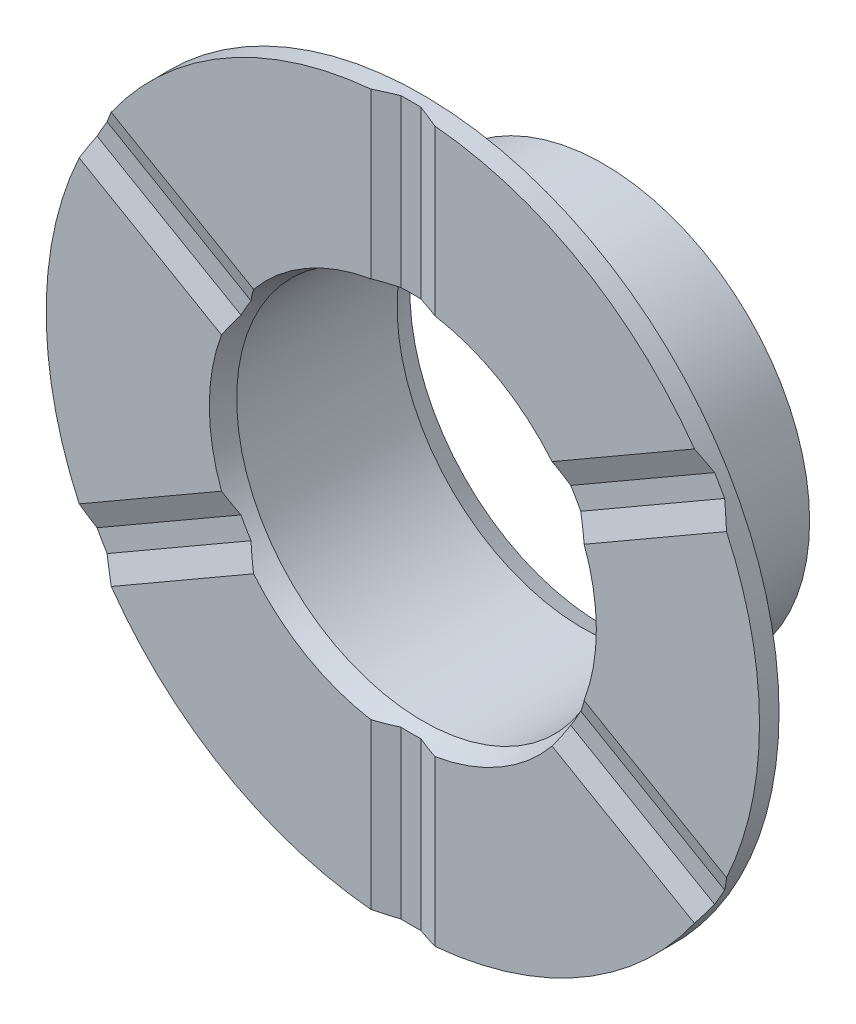
ISO-10303-21;
HEADER;
FILE_DESCRIPTION(('STEP AP214'),'2;1');
FILE_NAME('part.step','',(''),(''),'','','');
FILE_SCHEMA(('AUTOMOTIVE_DESIGN { 1 0 10303 214 1 1 1 1 }'));
ENDSEC;
DATA;
#1=APPLICATION_CONTEXT('core data for automotive mechanical design processes');
#2=APPLICATION_PROTOCOL_DEFINITION('international standard','automotive_design',2000,#1);
#3=PRODUCT_CONTEXT('',#1,'mechanical');
#4=PRODUCT('Part','Part','',(#3));
#5=PRODUCT_RELATED_PRODUCT_CATEGORY('part','',(#4));
#6=PRODUCT_DEFINITION_FORMATION('','',#4);
#7=PRODUCT_DEFINITION_CONTEXT('part definition',#1,'design');
#8=PRODUCT_DEFINITION('design','',#6,#7);
#9=PRODUCT_DEFINITION_SHAPE('','',#8);
#10=(LENGTH_UNIT() NAMED_UNIT(*) SI_UNIT(.MILLI.,.METRE.));
#11=(NAMED_UNIT(*) PLANE_ANGLE_UNIT() SI_UNIT($,.RADIAN.));
#12=(NAMED_UNIT(*) SI_UNIT($,.STERADIAN.) SOLID_ANGLE_UNIT());
#13=UNCERTAINTY_MEASURE_WITH_UNIT(LENGTH_MEASURE(1.E-05),#10,'distance_accuracy_value','');
#14=(GEOMETRIC_REPRESENTATION_CONTEXT(3) GLOBAL_UNCERTAINTY_ASSIGNED_CONTEXT((#13)) GLOBAL_UNIT_ASSIGNED_CONTEXT((#10,
#11,#12)) REPRESENTATION_CONTEXT('',''));
#15=CARTESIAN_POINT('',(0.,0.,0.));
#16=DIRECTION('',(0.,0.,1.));
#17=DIRECTION('',(1.,0.,0.));
#18=AXIS2_PLACEMENT_3D('',#15,#16,#17);
#19=CARTESIAN_POINT('',(0.,0.,20.));
#20=DIRECTION('',(0.,0.,1.));
#21=DIRECTION('',(1.,0.,0.));
#22=AXIS2_PLACEMENT_3D('',#19,#20,#21);
#23=PLANE('',#22);
#24=CARTESIAN_POINT('',(0.,0.,20.));
#25=DIRECTION('',(0.,0.,1.));
#26=DIRECTION('',(1.,0.,0.));
#27=AXIS2_PLACEMENT_3D('',#24,#25,#26);
#28=CIRCLE('',#27,35.575);
#29=CARTESIAN_POINT('',(32.2831098634722,-14.9459507072311,20.));
#30=VERTEX_POINT('',#29);
#31=CARTESIAN_POINT('',(32.2831098634719,14.9459507072317,20.));
#32=VERTEX_POINT('',#31);
#33=EDGE_CURVE('E497',#30,#32,#28,.T.);
#34=ORIENTED_EDGE('',*,*,#33,.T.);
#35=DIRECTION('',(-0.866025403784433,-0.50000000000001,0.));
#36=VECTOR('',#35,1.);
#37=CARTESIAN_POINT('',(18.2933802362989,6.86897654109306,20.));
#38=LINE('',#37,#36);
#39=CARTESIAN_POINT('',(18.0848126550267,6.74855999190134,20.));
#40=VERTEX_POINT('',#39);
#41=EDGE_CURVE('E66',#32,#40,#38,.T.);
#42=ORIENTED_EDGE('',*,*,#41,.T.);
#43=CARTESIAN_POINT('',(0.,0.,20.));
#44=DIRECTION('',(0.,0.,1.));
#45=DIRECTION('',(1.,0.,0.));
#46=AXIS2_PLACEMENT_3D('',#43,#44,#45);
#47=CIRCLE('',#46,19.3029404685324);
#48=CARTESIAN_POINT('',(18.0848126550268,-6.74855999190097,20.));
#49=VERTEX_POINT('',#48);
#50=EDGE_CURVE('E309',#40,#49,#47,.F.);
#51=ORIENTED_EDGE('',*,*,#50,.T.);
#52=DIRECTION('',(0.866025403784443,-0.499999999999992,0.));
#53=VECTOR('',#52,1.);
#54=CARTESIAN_POINT('',(32.3956704762939,-15.0109376073438,20.));
#55=LINE('',#54,#53);
#56=EDGE_CURVE('E415',#49,#30,#55,.T.);
#57=ORIENTED_EDGE('',*,*,#56,.T.);
#58=EDGE_LOOP('',(#34,#42,#51,#57));
#59=FACE_BOUND('',#58,.T.);
#60=ADVANCED_FACE('F41',(#59),#23,.T.);
#61=CARTESIAN_POINT('',(3.19798193556369,-35.4309686085465,20.));
#62=VERTEX_POINT('',#61);
#63=CARTESIAN_POINT('',(29.0851279279086,-20.4850179013149,20.));
#64=VERTEX_POINT('',#63);
#65=EDGE_CURVE('E492',#62,#64,#28,.T.);
#66=ORIENTED_EDGE('',*,*,#65,.T.);
#67=DIRECTION('',(-0.866025403784443,0.499999999999992,0.));
#68=VECTOR('',#67,1.);
#69=CARTESIAN_POINT('',(15.0953983007354,-12.4080437351765,20.));
#70=LINE('',#69,#68);
#71=CARTESIAN_POINT('',(14.8868307194632,-12.2876271859848,20.));
#72=VERTEX_POINT('',#71);
#73=EDGE_CURVE('E405',#64,#72,#70,.T.);
#74=ORIENTED_EDGE('',*,*,#73,.T.);
#75=CARTESIAN_POINT('',(3.19798193556368,-19.0361871778861,20.));
#76=VERTEX_POINT('',#75);
#77=EDGE_CURVE('E799',#72,#76,#47,.F.);
#78=ORIENTED_EDGE('',*,*,#77,.T.);
#79=DIRECTION('',(0.,-1.,0.));
#80=VECTOR('',#79,1.);
#81=CARTESIAN_POINT('',(3.19798193556369,-35.560942408772,20.));
#82=LINE('',#81,#80);
#83=EDGE_CURVE('E396',#76,#62,#82,.T.);
#84=ORIENTED_EDGE('',*,*,#83,.T.);
#85=EDGE_LOOP('',(#66,#74,#78,#84));
#86=FACE_BOUND('',#85,.T.);
#87=ADVANCED_FACE('F538',(#86),#23,.T.);
#88=CARTESIAN_POINT('',(-29.0851279279083,-20.4850179013153,20.));
#89=VERTEX_POINT('',#88);
#90=CARTESIAN_POINT('',(-3.19798193556368,-35.4309686085465,20.));
#91=VERTEX_POINT('',#90);
#92=EDGE_CURVE('E477',#89,#91,#28,.T.);
#93=ORIENTED_EDGE('',*,*,#92,.T.);
#94=DIRECTION('',(0.,1.,0.));
#95=VECTOR('',#94,1.);
#96=CARTESIAN_POINT('',(-3.19798193556368,-19.2770202762695,20.));
#97=LINE('',#96,#95);
#98=CARTESIAN_POINT('',(-3.19798193556368,-19.0361871778861,20.));
#99=VERTEX_POINT('',#98);
#100=EDGE_CURVE('E386',#91,#99,#97,.T.);
#101=ORIENTED_EDGE('',*,*,#100,.T.);
#102=CARTESIAN_POINT('',(-14.886830719463,-12.287627185985,20.));
#103=VERTEX_POINT('',#102);
#104=EDGE_CURVE('E807',#99,#103,#47,.F.);
#105=ORIENTED_EDGE('',*,*,#104,.T.);
#106=DIRECTION('',(-0.866025403784436,-0.500000000000004,0.));
#107=VECTOR('',#106,1.);
#108=CARTESIAN_POINT('',(-29.19768854073,-20.550004801428,20.));
#109=LINE('',#108,#107);
#110=EDGE_CURVE('E377',#103,#89,#109,.T.);
#111=ORIENTED_EDGE('',*,*,#110,.T.);
#112=EDGE_LOOP('',(#93,#101,#105,#111));
#113=FACE_BOUND('',#112,.T.);
#114=ADVANCED_FACE('F543',(#113),#23,.T.);
#115=CARTESIAN_POINT('',(-32.2831098634721,14.9459507072313,20.));
#116=VERTEX_POINT('',#115);
#117=CARTESIAN_POINT('',(-32.283109863472,-14.9459507072315,20.));
#118=VERTEX_POINT('',#117);
#119=EDGE_CURVE('E289',#116,#118,#28,.T.);
#120=ORIENTED_EDGE('',*,*,#119,.T.);
#121=DIRECTION('',(0.866025403784436,0.500000000000004,0.));
#122=VECTOR('',#121,1.);
#123=CARTESIAN_POINT('',(-18.2933802362989,-6.86897654109293,20.));
#124=LINE('',#123,#122);
#125=CARTESIAN_POINT('',(-18.0848126550267,-6.74855999190122,20.));
#126=VERTEX_POINT('',#125);
#127=EDGE_CURVE('E367',#118,#126,#124,.T.);
#128=ORIENTED_EDGE('',*,*,#127,.T.);
#129=CARTESIAN_POINT('',(-18.0848126550268,6.7485599919011,20.));
#130=VERTEX_POINT('',#129);
#131=EDGE_CURVE('E483',#126,#130,#47,.F.);
#132=ORIENTED_EDGE('',*,*,#131,.T.);
#133=DIRECTION('',(-0.86602540378444,0.499999999999998,0.));
#134=VECTOR('',#133,1.);
#135=CARTESIAN_POINT('',(-32.3956704762938,15.010937607344,20.));
#136=LINE('',#135,#134);
#137=EDGE_CURVE('E217',#130,#116,#136,.T.);
#138=ORIENTED_EDGE('',*,*,#137,.T.);
#139=EDGE_LOOP('',(#120,#128,#132,#138));
#140=FACE_BOUND('',#139,.T.);
#141=ADVANCED_FACE('F487',(#140),#23,.T.);
#142=CARTESIAN_POINT('',(-3.19798193556369,35.4309686085465,20.));
#143=VERTEX_POINT('',#142);
#144=CARTESIAN_POINT('',(-29.0851279279085,20.4850179013151,20.));
#145=VERTEX_POINT('',#144);
#146=EDGE_CURVE('E285',#143,#145,#28,.T.);
#147=ORIENTED_EDGE('',*,*,#146,.T.);
#148=DIRECTION('',(0.86602540378444,-0.499999999999998,0.));
#149=VECTOR('',#148,1.);
#150=CARTESIAN_POINT('',(-15.0953983007353,12.4080437351766,20.));
#151=LINE('',#150,#149);
#152=CARTESIAN_POINT('',(-14.8868307194631,12.2876271859849,20.));
#153=VERTEX_POINT('',#152);
#154=EDGE_CURVE('E354',#145,#153,#151,.T.);
#155=ORIENTED_EDGE('',*,*,#154,.T.);
#156=CARTESIAN_POINT('',(-3.19798193556368,19.0361871778861,20.));
#157=VERTEX_POINT('',#156);
#158=EDGE_CURVE('E212',#153,#157,#47,.F.);
#159=ORIENTED_EDGE('',*,*,#158,.T.);
#160=DIRECTION('',(0.,1.,0.));
#161=VECTOR('',#160,1.);
#162=CARTESIAN_POINT('',(-3.19798193556369,35.560942408772,20.));
#163=LINE('',#162,#161);
#164=EDGE_CURVE('E324',#157,#143,#163,.T.);
#165=ORIENTED_EDGE('',*,*,#164,.T.);
#166=EDGE_LOOP('',(#147,#155,#159,#165));
#167=FACE_BOUND('',#166,.T.);
#168=ADVANCED_FACE('F525',(#167),#23,.T.);
#169=CARTESIAN_POINT('',(0.,0.,20.));
#170=DIRECTION('',(0.,0.,-1.));
#171=DIRECTION('',(-1.,0.,0.));
#172=AXIS2_PLACEMENT_3D('',#169,#170,#171);
#173=CYLINDRICAL_SURFACE('',#172,20.575);
#174=CARTESIAN_POINT('',(0.,0.,0.));
#175=DIRECTION('',(0.,0.,1.));
#176=DIRECTION('',(1.,0.,0.));
#177=AXIS2_PLACEMENT_3D('',#174,#175,#176);
#178=CIRCLE('',#177,20.575);
#179=CARTESIAN_POINT('',(20.575,0.,0.));
#180=VERTEX_POINT('',#179);
#181=EDGE_CURVE('E284',#180,#180,#178,.T.);
#182=ORIENTED_EDGE('',*,*,#181,.T.);
#183=EDGE_LOOP('',(#182));
#184=FACE_BOUND('',#183,.T.);
#185=CARTESIAN_POINT('',(0.,0.,18.05));
#186=DIRECTION('',(0.,0.,1.));
#187=DIRECTION('',(1.,0.,0.));
#188=AXIS2_PLACEMENT_3D('',#185,#186,#187);
#189=CIRCLE('',#188,20.575);
#190=CARTESIAN_POINT('',(20.575,0.,18.05));
#191=VERTEX_POINT('',#190);
#192=EDGE_CURVE('E293',#191,#191,#189,.T.);
#193=ORIENTED_EDGE('',*,*,#192,.F.);
#194=EDGE_LOOP('',(#193));
#195=FACE_BOUND('',#194,.T.);
#196=ADVANCED_FACE('F548',(#184,#195),#173,.T.);
#197=CARTESIAN_POINT('',(3.19798193556368,19.0361871778861,20.));
#198=VERTEX_POINT('',#197);
#199=CARTESIAN_POINT('',(14.8868307194629,12.2876271859851,20.));
#200=VERTEX_POINT('',#199);
#201=EDGE_CURVE('E305',#198,#200,#47,.F.);
#202=ORIENTED_EDGE('',*,*,#201,.T.);
#203=DIRECTION('',(0.866025403784433,0.50000000000001,0.));
#204=VECTOR('',#203,1.);
#205=CARTESIAN_POINT('',(29.1976885407299,20.5500048014283,20.));
#206=LINE('',#205,#204);
#207=CARTESIAN_POINT('',(29.0851279279082,20.4850179013155,20.));
#208=VERTEX_POINT('',#207);
#209=EDGE_CURVE('E11',#200,#208,#206,.T.);
#210=ORIENTED_EDGE('',*,*,#209,.T.);
#211=CARTESIAN_POINT('',(3.19798193556368,35.4309686085465,20.));
#212=VERTEX_POINT('',#211);
#213=EDGE_CURVE('E279',#208,#212,#28,.T.);
#214=ORIENTED_EDGE('',*,*,#213,.T.);
#215=DIRECTION('',(0.,-1.,0.));
#216=VECTOR('',#215,1.);
#217=CARTESIAN_POINT('',(3.19798193556368,19.2770202762695,20.));
#218=LINE('',#217,#216);
#219=EDGE_CURVE('E327',#212,#198,#218,.T.);
#220=ORIENTED_EDGE('',*,*,#219,.T.);
#221=EDGE_LOOP('',(#202,#210,#214,#220));
#222=FACE_BOUND('',#221,.T.);
#223=ADVANCED_FACE('F506',(#222),#23,.T.);
#224=CARTESIAN_POINT('',(0.,0.,0.));
#225=DIRECTION('',(0.,0.,1.));
#226=DIRECTION('',(1.,0.,0.));
#227=AXIS2_PLACEMENT_3D('',#224,#225,#226);
#228=PLANE('',#227);
#229=CARTESIAN_POINT('',(0.,0.,0.));
#230=DIRECTION('',(0.,0.,1.));
#231=DIRECTION('',(1.,0.,0.));
#232=AXIS2_PLACEMENT_3D('',#229,#230,#231);
#233=CIRCLE('',#232,19.3029404685324);
#234=CARTESIAN_POINT('',(19.3029404685324,0.,0.));
#235=VERTEX_POINT('',#234);
#236=EDGE_CURVE('E308',#235,#235,#233,.T.);
#237=ORIENTED_EDGE('',*,*,#236,.T.);
#238=EDGE_LOOP('',(#237));
#239=FACE_BOUND('',#238,.T.);
#240=ORIENTED_EDGE('',*,*,#181,.F.);
#241=EDGE_LOOP('',(#240));
#242=FACE_BOUND('',#241,.T.);
#243=ADVANCED_FACE('F547',(#239,#242),#228,.F.);
#244=CARTESIAN_POINT('',(0.,0.,20.));
#245=DIRECTION('',(0.,0.,-1.));
#246=DIRECTION('',(-1.,0.,0.));
#247=AXIS2_PLACEMENT_3D('',#244,#245,#246);
#248=CYLINDRICAL_SURFACE('',#247,18.575);
#249=CARTESIAN_POINT('',(0.,0.,18.));
#250=DIRECTION('',(0.,0.,1.));
#251=DIRECTION('',(1.,0.,0.));
#252=AXIS2_PLACEMENT_3D('',#249,#250,#251);
#253=CIRCLE('',#252,18.575);
#254=CARTESIAN_POINT('',(18.575,0.,18.));
#255=VERTEX_POINT('',#254);
#256=EDGE_CURVE('E301',#255,#255,#253,.T.);
#257=ORIENTED_EDGE('',*,*,#256,.T.);
#258=EDGE_LOOP('',(#257));
#259=FACE_BOUND('',#258,.T.);
#260=CARTESIAN_POINT('',(0.,0.,2.00000000000007));
#261=DIRECTION('',(0.,0.,1.));
#262=DIRECTION('',(1.,0.,0.));
#263=AXIS2_PLACEMENT_3D('',#260,#261,#262);
#264=CIRCLE('',#263,18.575);
#265=CARTESIAN_POINT('',(18.575,0.,2.00000000000007));
#266=VERTEX_POINT('',#265);
#267=EDGE_CURVE('E297',#266,#266,#264,.F.);
#268=ORIENTED_EDGE('',*,*,#267,.T.);
#269=EDGE_LOOP('',(#268));
#270=FACE_BOUND('',#269,.T.);
#271=ADVANCED_FACE('F553',(#259,#270),#248,.F.);
#272=CARTESIAN_POINT('',(0.,0.,18.05));
#273=DIRECTION('',(0.,0.,1.));
#274=DIRECTION('',(1.,0.,0.));
#275=AXIS2_PLACEMENT_3D('',#272,#273,#274);
#276=CYLINDRICAL_SURFACE('',#275,35.575);
#277=CARTESIAN_POINT('',(0.,0.,19.2));
#278=DIRECTION('',(0.,0.,1.));
#279=DIRECTION('',(1.,0.,0.));
#280=AXIS2_PLACEMENT_3D('',#277,#278,#279);
#281=CIRCLE('',#280,35.575);
#282=CARTESIAN_POINT('',(30.2966795085117,18.6464966081708,19.2));
#283=VERTEX_POINT('',#282);
#284=CARTESIAN_POINT('',(31.2966795085118,16.9144458006019,19.2));
#285=VERTEX_POINT('',#284);
#286=EDGE_CURVE('E263',#283,#285,#281,.F.);
#287=ORIENTED_EDGE('',*,*,#286,.T.);
#288=CARTESIAN_POINT('',(0.,0.,18.8360297657338));
#289=DIRECTION('',(-0.171010071662837,0.29619813272602,0.939692620785909));
#290=DIRECTION('',(0.469846310392964,-0.813797681349369,0.342020143325667));
#291=AXIS2_PLACEMENT_3D('',#288,#289,#290);
#292=ELLIPSE('',#291,37.8581242558305,35.575);
#293=EDGE_CURVE('E421',#285,#32,#292,.F.);
#294=ORIENTED_EDGE('',*,*,#293,.T.);
#295=ORIENTED_EDGE('',*,*,#33,.F.);
#296=CARTESIAN_POINT('',(0.,0.,18.8360297657338));
#297=DIRECTION('',(-0.171010071662831,-0.296198132726025,0.939692620785908));
#298=DIRECTION('',(0.469846310392947,0.813797681349378,0.342020143325669));
#299=AXIS2_PLACEMENT_3D('',#296,#297,#298);
#300=ELLIPSE('',#299,37.8581242558306,35.575);
#301=CARTESIAN_POINT('',(31.2966795085121,-16.9144458006013,19.2));
#302=VERTEX_POINT('',#301);
#303=EDGE_CURVE('E399',#30,#302,#300,.F.);
#304=ORIENTED_EDGE('',*,*,#303,.T.);
#305=CARTESIAN_POINT('',(0.,0.,19.2));
#306=DIRECTION('',(0.,0.,1.));
#307=DIRECTION('',(1.,0.,0.));
#308=AXIS2_PLACEMENT_3D('',#305,#306,#307);
#309=CIRCLE('',#308,35.575);
#310=CARTESIAN_POINT('',(30.2966795085121,-18.6464966081702,19.2));
#311=VERTEX_POINT('',#310);
#312=EDGE_CURVE('E259',#302,#311,#309,.F.);
#313=ORIENTED_EDGE('',*,*,#312,.T.);
#314=CARTESIAN_POINT('',(0.,0.,18.8360297657338));
#315=DIRECTION('',(0.171010071662833,0.296198132726028,0.939692620785907));
#316=DIRECTION('',(-0.469846310392946,-0.813797681349377,0.342020143325671));
#317=AXIS2_PLACEMENT_3D('',#314,#315,#316);
#318=ELLIPSE('',#317,37.8581242558306,35.575);
#319=EDGE_CURVE('E402',#311,#64,#318,.F.);
#320=ORIENTED_EDGE('',*,*,#319,.T.);
#321=ORIENTED_EDGE('',*,*,#65,.F.);
#322=CARTESIAN_POINT('',(0.,0.,18.8360297657338));
#323=DIRECTION('',(-0.34202014332567,0.,0.939692620785908));
#324=DIRECTION('',(0.939692620785908,0.,0.34202014332567));
#325=AXIS2_PLACEMENT_3D('',#322,#323,#324);
#326=ELLIPSE('',#325,37.8581242558306,35.575);
#327=CARTESIAN_POINT('',(1.,-35.560942408772,19.2));
#328=VERTEX_POINT('',#327);
#329=EDGE_CURVE('E380',#62,#328,#326,.F.);
#330=ORIENTED_EDGE('',*,*,#329,.T.);
#331=CARTESIAN_POINT('',(0.,0.,19.2));
#332=DIRECTION('',(0.,0.,1.));
#333=DIRECTION('',(1.,0.,0.));
#334=AXIS2_PLACEMENT_3D('',#331,#332,#333);
#335=CIRCLE('',#334,35.575);
#336=CARTESIAN_POINT('',(-0.999999999999999,-35.560942408772,19.2));
#337=VERTEX_POINT('',#336);
#338=EDGE_CURVE('E255',#328,#337,#335,.F.);
#339=ORIENTED_EDGE('',*,*,#338,.T.);
#340=CARTESIAN_POINT('',(0.,0.,18.8360297657338));
#341=DIRECTION('',(0.34202014332567,0.,0.939692620785908));
#342=DIRECTION('',(-0.939692620785908,0.,0.34202014332567));
#343=AXIS2_PLACEMENT_3D('',#340,#341,#342);
#344=ELLIPSE('',#343,37.8581242558306,35.575);
#345=EDGE_CURVE('E383',#337,#91,#344,.F.);
#346=ORIENTED_EDGE('',*,*,#345,.T.);
#347=ORIENTED_EDGE('',*,*,#92,.F.);
#348=CARTESIAN_POINT('',(0.,0.,18.8360297657338));
#349=DIRECTION('',(-0.171010071662835,0.296198132726022,0.939692620785909));
#350=DIRECTION('',(0.469846310392958,-0.813797681349372,0.342020143325667));
#351=AXIS2_PLACEMENT_3D('',#348,#349,#350);
#352=ELLIPSE('',#351,37.8581242558305,35.575);
#353=CARTESIAN_POINT('',(-30.2966795085119,-18.6464966081706,19.2));
#354=VERTEX_POINT('',#353);
#355=EDGE_CURVE('E361',#89,#354,#352,.F.);
#356=ORIENTED_EDGE('',*,*,#355,.T.);
#357=CARTESIAN_POINT('',(0.,0.,19.2));
#358=DIRECTION('',(0.,0.,1.));
#359=DIRECTION('',(1.,0.,0.));
#360=AXIS2_PLACEMENT_3D('',#357,#358,#359);
#361=CIRCLE('',#360,35.575);
#362=CARTESIAN_POINT('',(-31.2966795085119,-16.9144458006017,19.2));
#363=VERTEX_POINT('',#362);
#364=EDGE_CURVE('E251',#354,#363,#361,.F.);
#365=ORIENTED_EDGE('',*,*,#364,.T.);
#366=CARTESIAN_POINT('',(0.,0.,18.8360297657338));
#367=DIRECTION('',(0.171010071662835,-0.296198132726022,0.939692620785909));
#368=DIRECTION('',(-0.469846310392958,0.813797681349372,0.342020143325667));
#369=AXIS2_PLACEMENT_3D('',#366,#367,#368);
#370=ELLIPSE('',#369,37.8581242558306,35.575);
#371=EDGE_CURVE('E364',#363,#118,#370,.F.);
#372=ORIENTED_EDGE('',*,*,#371,.T.);
#373=ORIENTED_EDGE('',*,*,#119,.F.);
#374=CARTESIAN_POINT('',(0.,0.,18.8360297657338));
#375=DIRECTION('',(0.171010071662834,0.296198132726025,0.939692620785908));
#376=DIRECTION('',(-0.469846310392952,-0.813797681349375,0.342020143325669));
#377=AXIS2_PLACEMENT_3D('',#374,#375,#376);
#378=ELLIPSE('',#377,37.8581242558306,35.575);
#379=CARTESIAN_POINT('',(-31.296679508512,16.9144458006015,19.2));
#380=VERTEX_POINT('',#379);
#381=EDGE_CURVE('E349',#116,#380,#378,.F.);
#382=ORIENTED_EDGE('',*,*,#381,.T.);
#383=CARTESIAN_POINT('',(0.,0.,19.2));
#384=DIRECTION('',(0.,0.,1.));
#385=DIRECTION('',(1.,0.,0.));
#386=AXIS2_PLACEMENT_3D('',#383,#384,#385);
#387=CIRCLE('',#386,35.575);
#388=CARTESIAN_POINT('',(-30.296679508512,18.6464966081704,19.2));
#389=VERTEX_POINT('',#388);
#390=EDGE_CURVE('E240',#380,#389,#387,.F.);
#391=ORIENTED_EDGE('',*,*,#390,.T.);
#392=CARTESIAN_POINT('',(0.,0.,18.8360297657338));
#393=DIRECTION('',(-0.171010071662834,-0.296198132726024,0.939692620785908));
#394=DIRECTION('',(0.469846310392952,0.813797681349375,0.342020143325669));
#395=AXIS2_PLACEMENT_3D('',#392,#393,#394);
#396=ELLIPSE('',#395,37.8581242558306,35.575);
#397=EDGE_CURVE('E234',#389,#145,#396,.F.);
#398=ORIENTED_EDGE('',*,*,#397,.T.);
#399=ORIENTED_EDGE('',*,*,#146,.F.);
#400=CARTESIAN_POINT('',(0.,0.,18.8360297657338));
#401=DIRECTION('',(0.34202014332567,0.,0.939692620785908));
#402=DIRECTION('',(-0.939692620785908,0.,0.34202014332567));
#403=AXIS2_PLACEMENT_3D('',#400,#401,#402);
#404=ELLIPSE('',#403,37.8581242558306,35.575);
#405=CARTESIAN_POINT('',(-1.,35.560942408772,19.2));
#406=VERTEX_POINT('',#405);
#407=EDGE_CURVE('E317',#143,#406,#404,.F.);
#408=ORIENTED_EDGE('',*,*,#407,.T.);
#409=CARTESIAN_POINT('',(0.,0.,19.2));
#410=DIRECTION('',(0.,0.,1.));
#411=DIRECTION('',(1.,0.,0.));
#412=AXIS2_PLACEMENT_3D('',#409,#410,#411);
#413=CIRCLE('',#412,35.575);
#414=CARTESIAN_POINT('',(0.999999999999999,35.560942408772,19.2));
#415=VERTEX_POINT('',#414);
#416=EDGE_CURVE('E275',#406,#415,#413,.F.);
#417=ORIENTED_EDGE('',*,*,#416,.T.);
#418=CARTESIAN_POINT('',(0.,0.,18.8360297657338));
#419=DIRECTION('',(-0.34202014332567,0.,0.939692620785908));
#420=DIRECTION('',(0.939692620785908,0.,0.34202014332567));
#421=AXIS2_PLACEMENT_3D('',#418,#419,#420);
#422=ELLIPSE('',#421,37.8581242558306,35.575);
#423=EDGE_CURVE('E320',#415,#212,#422,.F.);
#424=ORIENTED_EDGE('',*,*,#423,.T.);
#425=ORIENTED_EDGE('',*,*,#213,.F.);
#426=CARTESIAN_POINT('',(0.,0.,18.8360297657338));
#427=DIRECTION('',(0.171010071662837,-0.29619813272602,0.939692620785909));
#428=DIRECTION('',(-0.469846310392964,0.813797681349369,0.342020143325667));
#429=AXIS2_PLACEMENT_3D('',#426,#427,#428);
#430=ELLIPSE('',#429,37.8581242558305,35.575);
#431=EDGE_CURVE('E418',#208,#283,#430,.F.);
#432=ORIENTED_EDGE('',*,*,#431,.T.);
#433=EDGE_LOOP('',(#287,#294,#295,#304,#313,#320,#321,#330,#339,#346,#347,#356,#365,#372,#373,
#382,#391,#398,#399,#408,#417,#424,#425,#432));
#434=FACE_BOUND('',#433,.T.);
#435=CARTESIAN_POINT('',(0.,0.,18.05));
#436=DIRECTION('',(0.,0.,1.));
#437=DIRECTION('',(1.,0.,0.));
#438=AXIS2_PLACEMENT_3D('',#435,#436,#437);
#439=CIRCLE('',#438,35.575);
#440=CARTESIAN_POINT('',(35.575,0.,18.05));
#441=VERTEX_POINT('',#440);
#442=EDGE_CURVE('E280',#441,#441,#439,.T.);
#443=ORIENTED_EDGE('',*,*,#442,.T.);
#444=EDGE_LOOP('',(#443));
#445=FACE_BOUND('',#444,.T.);
#446=ADVANCED_FACE('F470',(#434,#445),#276,.T.);
#447=CARTESIAN_POINT('',(0.,0.,18.05));
#448=DIRECTION('',(0.,0.,1.));
#449=DIRECTION('',(1.,0.,0.));
#450=AXIS2_PLACEMENT_3D('',#447,#448,#449);
#451=PLANE('',#450);
#452=ORIENTED_EDGE('',*,*,#192,.T.);
#453=EDGE_LOOP('',(#452));
#454=FACE_BOUND('',#453,.T.);
#455=ORIENTED_EDGE('',*,*,#442,.F.);
#456=EDGE_LOOP('',(#455));
#457=FACE_BOUND('',#456,.T.);
#458=ADVANCED_FACE('F637',(#454,#457),#451,.F.);
#459=CARTESIAN_POINT('',(0.,0.,18.));
#460=DIRECTION('',(0.,0.,1.));
#461=DIRECTION('',(1.,0.,0.));
#462=AXIS2_PLACEMENT_3D('',#459,#460,#461);
#463=CONICAL_SURFACE('',#462,18.575,0.349065850398864);
#464=ORIENTED_EDGE('',*,*,#50,.F.);
#465=CARTESIAN_POINT('',(1.27284844521872,-2.20463817745381,19.762587659317));
#466=DIRECTION('',(-0.171010071662837,0.29619813272602,0.939692620785909));
#467=DIRECTION('',(0.469846310392964,-0.813797681349369,0.342020143325667));
#468=AXIS2_PLACEMENT_3D('',#465,#466,#467);
#469=ELLIPSE('',#468,20.4498034976636,19.0471633369991);
#470=CARTESIAN_POINT('',(16.9418790231115,8.62669787619248,19.2));
#471=VERTEX_POINT('',#470);
#472=EDGE_CURVE('E51',#40,#471,#469,.T.);
#473=ORIENTED_EDGE('',*,*,#472,.T.);
#474=CARTESIAN_POINT('',(0.,0.,19.2));
#475=DIRECTION('',(0.,0.,1.));
#476=DIRECTION('',(1.,0.,0.));
#477=AXIS2_PLACEMENT_3D('',#474,#475,#476);
#478=CIRCLE('',#477,19.0117642811194);
#479=CARTESIAN_POINT('',(15.9418790231114,10.3587486837613,19.2));
#480=VERTEX_POINT('',#479);
#481=EDGE_CURVE('E346',#471,#480,#478,.T.);
#482=ORIENTED_EDGE('',*,*,#481,.T.);
#483=CARTESIAN_POINT('',(-1.27284844521872,2.20463817745382,19.762587659317));
#484=DIRECTION('',(0.171010071662837,-0.29619813272602,0.939692620785909));
#485=DIRECTION('',(-0.469846310392964,0.813797681349369,0.342020143325667));
#486=AXIS2_PLACEMENT_3D('',#483,#484,#485);
#487=ELLIPSE('',#486,20.4498034976636,19.0471633369991);
#488=EDGE_CURVE('E58',#480,#200,#487,.T.);
#489=ORIENTED_EDGE('',*,*,#488,.T.);
#490=ORIENTED_EDGE('',*,*,#201,.F.);
#491=CARTESIAN_POINT('',(2.54569689043742,0.,19.762587659317));
#492=DIRECTION('',(-0.34202014332567,0.,0.939692620785908));
#493=DIRECTION('',(0.939692620785908,0.,0.34202014332567));
#494=AXIS2_PLACEMENT_3D('',#491,#492,#493);
#495=ELLIPSE('',#494,20.4498034976636,19.0471633369991);
#496=CARTESIAN_POINT('',(1.,18.9854465599534,19.2));
#497=VERTEX_POINT('',#496);
#498=EDGE_CURVE('E231',#198,#497,#495,.T.);
#499=ORIENTED_EDGE('',*,*,#498,.T.);
#500=CARTESIAN_POINT('',(0.,0.,19.2));
#501=DIRECTION('',(0.,0.,1.));
#502=DIRECTION('',(1.,0.,0.));
#503=AXIS2_PLACEMENT_3D('',#500,#501,#502);
#504=CIRCLE('',#503,19.0117642811194);
#505=CARTESIAN_POINT('',(-0.999999999999999,18.9854465599534,19.2));
#506=VERTEX_POINT('',#505);
#507=EDGE_CURVE('E313',#497,#506,#504,.T.);
#508=ORIENTED_EDGE('',*,*,#507,.T.);
#509=CARTESIAN_POINT('',(-2.54569689043742,0.,19.762587659317));
#510=DIRECTION('',(0.34202014332567,0.,0.939692620785908));
#511=DIRECTION('',(-0.939692620785908,0.,0.34202014332567));
#512=AXIS2_PLACEMENT_3D('',#509,#510,#511);
#513=ELLIPSE('',#512,20.4498034976636,19.0471633369991);
#514=EDGE_CURVE('E330',#506,#157,#513,.T.);
#515=ORIENTED_EDGE('',*,*,#514,.T.);
#516=ORIENTED_EDGE('',*,*,#158,.F.);
#517=CARTESIAN_POINT('',(1.2728484452187,2.20463817745385,19.762587659317));
#518=DIRECTION('',(-0.171010071662834,-0.296198132726024,0.939692620785908));
#519=DIRECTION('',(0.469846310392952,0.813797681349375,0.342020143325669));
#520=AXIS2_PLACEMENT_3D('',#517,#518,#519);
#521=ELLIPSE('',#520,20.4498034976636,19.0471633369991);
#522=CARTESIAN_POINT('',(-15.9418790231116,10.3587486837611,19.2));
#523=VERTEX_POINT('',#522);
#524=EDGE_CURVE('E205',#153,#523,#521,.T.);
#525=ORIENTED_EDGE('',*,*,#524,.T.);
#526=CARTESIAN_POINT('',(0.,0.,19.2));
#527=DIRECTION('',(0.,0.,1.));
#528=DIRECTION('',(1.,0.,0.));
#529=AXIS2_PLACEMENT_3D('',#526,#527,#528);
#530=CIRCLE('',#529,19.0117642811194);
#531=CARTESIAN_POINT('',(-16.9418790231116,8.62669787619225,19.2));
#532=VERTEX_POINT('',#531);
#533=EDGE_CURVE('E210',#523,#532,#530,.T.);
#534=ORIENTED_EDGE('',*,*,#533,.T.);
#535=CARTESIAN_POINT('',(-1.2728484452187,-2.20463817745385,19.762587659317));
#536=DIRECTION('',(0.171010071662834,0.296198132726025,0.939692620785908));
#537=DIRECTION('',(-0.469846310392952,-0.813797681349375,0.342020143325669));
#538=AXIS2_PLACEMENT_3D('',#535,#536,#537);
#539=ELLIPSE('',#538,20.4498034976636,19.0471633369991);
#540=EDGE_CURVE('E218',#532,#130,#539,.T.);
#541=ORIENTED_EDGE('',*,*,#540,.T.);
#542=ORIENTED_EDGE('',*,*,#131,.F.);
#543=CARTESIAN_POINT('',(-1.27284844521871,2.20463817745383,19.762587659317));
#544=DIRECTION('',(0.171010071662835,-0.296198132726022,0.939692620785909));
#545=DIRECTION('',(-0.469846310392958,0.813797681349372,0.342020143325667));
#546=AXIS2_PLACEMENT_3D('',#543,#544,#545);
#547=ELLIPSE('',#546,20.4498034976636,19.0471633369991);
#548=CARTESIAN_POINT('',(-16.9418790231115,-8.62669787619236,19.2));
#549=VERTEX_POINT('',#548);
#550=EDGE_CURVE('E374',#126,#549,#547,.T.);
#551=ORIENTED_EDGE('',*,*,#550,.T.);
#552=CARTESIAN_POINT('',(0.,0.,19.2));
#553=DIRECTION('',(0.,0.,1.));
#554=DIRECTION('',(1.,0.,0.));
#555=AXIS2_PLACEMENT_3D('',#552,#553,#554);
#556=CIRCLE('',#555,19.0117642811194);
#557=CARTESIAN_POINT('',(-15.9418790231115,-10.3587486837612,19.2));
#558=VERTEX_POINT('',#557);
#559=EDGE_CURVE('E230',#549,#558,#556,.T.);
#560=ORIENTED_EDGE('',*,*,#559,.T.);
#561=CARTESIAN_POINT('',(1.27284844521871,-2.20463817745383,19.762587659317));
#562=DIRECTION('',(-0.171010071662835,0.296198132726022,0.939692620785909));
#563=DIRECTION('',(0.469846310392958,-0.813797681349372,0.342020143325667));
#564=AXIS2_PLACEMENT_3D('',#561,#562,#563);
#565=ELLIPSE('',#564,20.4498034976636,19.0471633369991);
#566=EDGE_CURVE('E370',#558,#103,#565,.T.);
#567=ORIENTED_EDGE('',*,*,#566,.T.);
#568=ORIENTED_EDGE('',*,*,#104,.F.);
#569=CARTESIAN_POINT('',(-2.54569689043742,0.,19.762587659317));
#570=DIRECTION('',(0.34202014332567,0.,0.939692620785908));
#571=DIRECTION('',(-0.939692620785908,0.,0.34202014332567));
#572=AXIS2_PLACEMENT_3D('',#569,#570,#571);
#573=ELLIPSE('',#572,20.4498034976636,19.0471633369991);
#574=CARTESIAN_POINT('',(-1.,-18.9854465599534,19.2));
#575=VERTEX_POINT('',#574);
#576=EDGE_CURVE('E393',#99,#575,#573,.T.);
#577=ORIENTED_EDGE('',*,*,#576,.T.);
#578=CARTESIAN_POINT('',(0.,0.,19.2));
#579=DIRECTION('',(0.,0.,1.));
#580=DIRECTION('',(1.,0.,0.));
#581=AXIS2_PLACEMENT_3D('',#578,#579,#580);
#582=CIRCLE('',#581,19.0117642811194);
#583=CARTESIAN_POINT('',(0.999999999999999,-18.9854465599534,19.2));
#584=VERTEX_POINT('',#583);
#585=EDGE_CURVE('E338',#575,#584,#582,.T.);
#586=ORIENTED_EDGE('',*,*,#585,.T.);
#587=CARTESIAN_POINT('',(2.54569689043742,0.,19.762587659317));
#588=DIRECTION('',(-0.34202014332567,0.,0.939692620785908));
#589=DIRECTION('',(0.939692620785908,0.,0.34202014332567));
#590=AXIS2_PLACEMENT_3D('',#587,#588,#589);
#591=ELLIPSE('',#590,20.4498034976636,19.0471633369991);
#592=EDGE_CURVE('E389',#584,#76,#591,.T.);
#593=ORIENTED_EDGE('',*,*,#592,.T.);
#594=ORIENTED_EDGE('',*,*,#77,.F.);
#595=CARTESIAN_POINT('',(-1.27284844521869,-2.20463817745388,19.7625876593171));
#596=DIRECTION('',(0.171010071662833,0.296198132726028,0.939692620785907));
#597=DIRECTION('',(-0.469846310392946,-0.813797681349377,0.342020143325671));
#598=AXIS2_PLACEMENT_3D('',#595,#596,#597);
#599=ELLIPSE('',#598,20.4498034976636,19.0471633369991);
#600=CARTESIAN_POINT('',(15.9418790231117,-10.358748683761,19.2));
#601=VERTEX_POINT('',#600);
#602=EDGE_CURVE('E412',#72,#601,#599,.T.);
#603=ORIENTED_EDGE('',*,*,#602,.T.);
#604=CARTESIAN_POINT('',(0.,0.,19.2));
#605=DIRECTION('',(0.,0.,1.));
#606=DIRECTION('',(1.,0.,0.));
#607=AXIS2_PLACEMENT_3D('',#604,#605,#606);
#608=CIRCLE('',#607,19.0117642811194);
#609=CARTESIAN_POINT('',(16.9418790231116,-8.62669787619213,19.2));
#610=VERTEX_POINT('',#609);
#611=EDGE_CURVE('E342',#601,#610,#608,.T.);
#612=ORIENTED_EDGE('',*,*,#611,.T.);
#613=CARTESIAN_POINT('',(1.27284844521868,2.20463817745386,19.762587659317));
#614=DIRECTION('',(-0.171010071662831,-0.296198132726025,0.939692620785908));
#615=DIRECTION('',(0.469846310392947,0.813797681349378,0.342020143325669));
#616=AXIS2_PLACEMENT_3D('',#613,#614,#615);
#617=ELLIPSE('',#616,20.4498034976636,19.0471633369991);
#618=EDGE_CURVE('E408',#610,#49,#617,.T.);
#619=ORIENTED_EDGE('',*,*,#618,.T.);
#620=EDGE_LOOP('',(#464,#473,#482,#489,#490,#499,#508,#515,#516,#525,#534,#541,#542,#551,#560,
#567,#568,#577,#586,#593,#594,#603,#612,#619));
#621=FACE_BOUND('',#620,.T.);
#622=ORIENTED_EDGE('',*,*,#256,.F.);
#623=EDGE_LOOP('',(#622));
#624=FACE_BOUND('',#623,.T.);
#625=ADVANCED_FACE('F207',(#621,#624),#463,.F.);
#626=CARTESIAN_POINT('',(0.,0.,0.));
#627=DIRECTION('',(0.,0.,-1.));
#628=DIRECTION('',(-1.,0.,0.));
#629=AXIS2_PLACEMENT_3D('',#626,#627,#628);
#630=CONICAL_SURFACE('',#629,19.3029404685324,0.349065850398863);
#631=ORIENTED_EDGE('',*,*,#267,.F.);
#632=EDGE_LOOP('',(#631));
#633=FACE_BOUND('',#632,.T.);
#634=ORIENTED_EDGE('',*,*,#236,.F.);
#635=EDGE_LOOP('',(#634));
#636=FACE_BOUND('',#635,.T.);
#637=ADVANCED_FACE('F604',(#633,#636),#630,.F.);
#638=CARTESIAN_POINT('',(0.,0.,19.2));
#639=DIRECTION('',(0.,0.,1.));
#640=DIRECTION('',(1.,0.,0.));
#641=AXIS2_PLACEMENT_3D('',#638,#639,#640);
#642=PLANE('',#641);
#643=DIRECTION('',(0.,-1.,0.));
#644=VECTOR('',#643,1.);
#645=CARTESIAN_POINT('',(-1.,36.575,19.2));
#646=LINE('',#645,#644);
#647=EDGE_CURVE('E271',#406,#506,#646,.T.);
#648=ORIENTED_EDGE('',*,*,#647,.T.);
#649=ORIENTED_EDGE('',*,*,#507,.F.);
#650=DIRECTION('',(0.,1.,0.));
#651=VECTOR('',#650,1.);
#652=CARTESIAN_POINT('',(0.999999999999999,36.575,19.2));
#653=LINE('',#652,#651);
#654=EDGE_CURVE('E267',#497,#415,#653,.T.);
#655=ORIENTED_EDGE('',*,*,#654,.T.);
#656=ORIENTED_EDGE('',*,*,#416,.F.);
#657=EDGE_LOOP('',(#648,#649,#655,#656));
#658=FACE_BOUND('',#657,.T.);
#659=ADVANCED_FACE('F517',(#658),#642,.T.);
#660=CARTESIAN_POINT('',(0.999999999999999,36.575,19.2));
#661=DIRECTION('',(-0.34202014332567,0.,0.939692620785908));
#662=DIRECTION('',(0.,-1.,0.));
#663=AXIS2_PLACEMENT_3D('',#660,#661,#662);
#664=PLANE('',#663);
#665=ORIENTED_EDGE('',*,*,#498,.F.);
#666=ORIENTED_EDGE('',*,*,#219,.F.);
#667=ORIENTED_EDGE('',*,*,#423,.F.);
#668=ORIENTED_EDGE('',*,*,#654,.F.);
#669=EDGE_LOOP('',(#665,#666,#667,#668));
#670=FACE_BOUND('',#669,.T.);
#671=ADVANCED_FACE('F514',(#670),#664,.T.);
#672=CARTESIAN_POINT('',(-1.,36.575,19.2));
#673=DIRECTION('',(0.34202014332567,0.,0.939692620785908));
#674=DIRECTION('',(0.,1.,0.));
#675=AXIS2_PLACEMENT_3D('',#672,#673,#674);
#676=PLANE('',#675);
#677=ORIENTED_EDGE('',*,*,#407,.F.);
#678=ORIENTED_EDGE('',*,*,#164,.F.);
#679=ORIENTED_EDGE('',*,*,#514,.F.);
#680=ORIENTED_EDGE('',*,*,#647,.F.);
#681=EDGE_LOOP('',(#677,#678,#679,#680));
#682=FACE_BOUND('',#681,.T.);
#683=ADVANCED_FACE('F521',(#682),#676,.T.);
#684=CARTESIAN_POINT('',(0.,0.,19.2));
#685=DIRECTION('',(0.,0.,1.));
#686=DIRECTION('',(0.499999999999998,0.86602540378444,0.));
#687=AXIS2_PLACEMENT_3D('',#684,#685,#686);
#688=PLANE('',#687);
#689=DIRECTION('',(0.86602540378444,-0.499999999999998,0.));
#690=VECTOR('',#689,1.);
#691=CARTESIAN_POINT('',(-32.1748791434159,17.4214745962155,19.2));
#692=LINE('',#691,#690);
#693=EDGE_CURVE('E228',#380,#532,#692,.T.);
#694=ORIENTED_EDGE('',*,*,#693,.T.);
#695=ORIENTED_EDGE('',*,*,#533,.F.);
#696=DIRECTION('',(-0.86602540378444,0.499999999999998,0.));
#697=VECTOR('',#696,1.);
#698=CARTESIAN_POINT('',(-31.1748791434159,19.1535254037844,19.2));
#699=LINE('',#698,#697);
#700=EDGE_CURVE('E225',#523,#389,#699,.T.);
#701=ORIENTED_EDGE('',*,*,#700,.T.);
#702=ORIENTED_EDGE('',*,*,#390,.F.);
#703=EDGE_LOOP('',(#694,#695,#701,#702));
#704=FACE_BOUND('',#703,.T.);
#705=ADVANCED_FACE('F223',(#704),#688,.T.);
#706=CARTESIAN_POINT('',(0.,0.,19.2));
#707=DIRECTION('',(0.,0.,1.));
#708=DIRECTION('',(-0.500000000000004,0.866025403784436,0.));
#709=AXIS2_PLACEMENT_3D('',#706,#707,#708);
#710=PLANE('',#709);
#711=DIRECTION('',(0.866025403784436,0.500000000000004,0.));
#712=VECTOR('',#711,1.);
#713=CARTESIAN_POINT('',(-31.1748791434158,-19.1535254037846,19.2));
#714=LINE('',#713,#712);
#715=EDGE_CURVE('E236',#354,#558,#714,.T.);
#716=ORIENTED_EDGE('',*,*,#715,.T.);
#717=ORIENTED_EDGE('',*,*,#559,.F.);
#718=DIRECTION('',(-0.866025403784436,-0.500000000000004,0.));
#719=VECTOR('',#718,1.);
#720=CARTESIAN_POINT('',(-32.1748791434158,-17.4214745962157,19.2));
#721=LINE('',#720,#719);
#722=EDGE_CURVE('E243',#549,#363,#721,.T.);
#723=ORIENTED_EDGE('',*,*,#722,.T.);
#724=ORIENTED_EDGE('',*,*,#364,.F.);
#725=EDGE_LOOP('',(#716,#717,#723,#724));
#726=FACE_BOUND('',#725,.T.);
#727=ADVANCED_FACE('F465',(#726),#710,.T.);
#728=CARTESIAN_POINT('',(0.,0.,19.2));
#729=DIRECTION('',(0.,0.,1.));
#730=DIRECTION('',(-1.,0.,0.));
#731=AXIS2_PLACEMENT_3D('',#728,#729,#730);
#732=PLANE('',#731);
#733=DIRECTION('',(0.,1.,0.));
#734=VECTOR('',#733,1.);
#735=CARTESIAN_POINT('',(1.,-36.575,19.2));
#736=LINE('',#735,#734);
#737=EDGE_CURVE('E452',#328,#584,#736,.T.);
#738=ORIENTED_EDGE('',*,*,#737,.T.);
#739=ORIENTED_EDGE('',*,*,#585,.F.);
#740=DIRECTION('',(0.,-1.,0.));
#741=VECTOR('',#740,1.);
#742=CARTESIAN_POINT('',(-0.999999999999999,-36.575,19.2));
#743=LINE('',#742,#741);
#744=EDGE_CURVE('E448',#575,#337,#743,.T.);
#745=ORIENTED_EDGE('',*,*,#744,.T.);
#746=ORIENTED_EDGE('',*,*,#338,.F.);
#747=EDGE_LOOP('',(#738,#739,#745,#746));
#748=FACE_BOUND('',#747,.T.);
#749=ADVANCED_FACE('F681',(#748),#732,.T.);
#750=CARTESIAN_POINT('',(0.,0.,19.2));
#751=DIRECTION('',(0.,0.,1.));
#752=DIRECTION('',(-0.499999999999992,-0.866025403784443,0.));
#753=AXIS2_PLACEMENT_3D('',#750,#751,#752);
#754=PLANE('',#753);
#755=DIRECTION('',(-0.866025403784443,0.499999999999992,0.));
#756=VECTOR('',#755,1.);
#757=CARTESIAN_POINT('',(32.174879143416,-17.4214745962153,19.2));
#758=LINE('',#757,#756);
#759=EDGE_CURVE('E444',#302,#610,#758,.T.);
#760=ORIENTED_EDGE('',*,*,#759,.T.);
#761=ORIENTED_EDGE('',*,*,#611,.F.);
#762=DIRECTION('',(0.866025403784443,-0.499999999999992,0.));
#763=VECTOR('',#762,1.);
#764=CARTESIAN_POINT('',(31.174879143416,-19.1535254037841,19.2));
#765=LINE('',#764,#763);
#766=EDGE_CURVE('E442',#601,#311,#765,.T.);
#767=ORIENTED_EDGE('',*,*,#766,.T.);
#768=ORIENTED_EDGE('',*,*,#312,.F.);
#769=EDGE_LOOP('',(#760,#761,#767,#768));
#770=FACE_BOUND('',#769,.T.);
#771=ADVANCED_FACE('F690',(#770),#754,.T.);
#772=CARTESIAN_POINT('',(0.,0.,19.2));
#773=DIRECTION('',(0.,0.,1.));
#774=DIRECTION('',(0.50000000000001,-0.866025403784433,0.));
#775=AXIS2_PLACEMENT_3D('',#772,#773,#774);
#776=PLANE('',#775);
#777=DIRECTION('',(-0.866025403784433,-0.50000000000001,0.));
#778=VECTOR('',#777,1.);
#779=CARTESIAN_POINT('',(31.1748791434156,19.1535254037848,19.2));
#780=LINE('',#779,#778);
#781=EDGE_CURVE('E246',#283,#480,#780,.T.);
#782=ORIENTED_EDGE('',*,*,#781,.T.);
#783=ORIENTED_EDGE('',*,*,#481,.F.);
#784=DIRECTION('',(0.866025403784433,0.50000000000001,0.));
#785=VECTOR('',#784,1.);
#786=CARTESIAN_POINT('',(32.1748791434156,17.4214745962159,19.2));
#787=LINE('',#786,#785);
#788=EDGE_CURVE('E437',#471,#285,#787,.T.);
#789=ORIENTED_EDGE('',*,*,#788,.T.);
#790=ORIENTED_EDGE('',*,*,#286,.F.);
#791=EDGE_LOOP('',(#782,#783,#789,#790));
#792=FACE_BOUND('',#791,.T.);
#793=ADVANCED_FACE('F435',(#792),#776,.T.);
#794=CARTESIAN_POINT('',(-31.1748791434159,19.1535254037844,19.2));
#795=DIRECTION('',(-0.171010071662834,-0.296198132726024,0.939692620785908));
#796=DIRECTION('',(0.86602540378444,-0.499999999999998,0.));
#797=AXIS2_PLACEMENT_3D('',#794,#795,#796);
#798=PLANE('',#797);
#799=ORIENTED_EDGE('',*,*,#524,.F.);
#800=ORIENTED_EDGE('',*,*,#154,.F.);
#801=ORIENTED_EDGE('',*,*,#397,.F.);
#802=ORIENTED_EDGE('',*,*,#700,.F.);
#803=EDGE_LOOP('',(#799,#800,#801,#802));
#804=FACE_BOUND('',#803,.T.);
#805=ADVANCED_FACE('F233',(#804),#798,.T.);
#806=CARTESIAN_POINT('',(-32.1748791434159,17.4214745962155,19.2));
#807=DIRECTION('',(0.171010071662834,0.296198132726025,0.939692620785908));
#808=DIRECTION('',(-0.86602540378444,0.499999999999998,0.));
#809=AXIS2_PLACEMENT_3D('',#806,#807,#808);
#810=PLANE('',#809);
#811=ORIENTED_EDGE('',*,*,#381,.F.);
#812=ORIENTED_EDGE('',*,*,#137,.F.);
#813=ORIENTED_EDGE('',*,*,#540,.F.);
#814=ORIENTED_EDGE('',*,*,#693,.F.);
#815=EDGE_LOOP('',(#811,#812,#813,#814));
#816=FACE_BOUND('',#815,.T.);
#817=ADVANCED_FACE('F527',(#816),#810,.T.);
#818=CARTESIAN_POINT('',(-32.1748791434158,-17.4214745962157,19.2));
#819=DIRECTION('',(0.171010071662835,-0.296198132726022,0.939692620785909));
#820=DIRECTION('',(0.866025403784436,0.500000000000004,0.));
#821=AXIS2_PLACEMENT_3D('',#818,#819,#820);
#822=PLANE('',#821);
#823=ORIENTED_EDGE('',*,*,#550,.F.);
#824=ORIENTED_EDGE('',*,*,#127,.F.);
#825=ORIENTED_EDGE('',*,*,#371,.F.);
#826=ORIENTED_EDGE('',*,*,#722,.F.);
#827=EDGE_LOOP('',(#823,#824,#825,#826));
#828=FACE_BOUND('',#827,.T.);
#829=ADVANCED_FACE('F485',(#828),#822,.T.);
#830=CARTESIAN_POINT('',(-31.1748791434158,-19.1535254037846,19.2));
#831=DIRECTION('',(-0.171010071662835,0.296198132726022,0.939692620785909));
#832=DIRECTION('',(-0.866025403784436,-0.500000000000004,0.));
#833=AXIS2_PLACEMENT_3D('',#830,#831,#832);
#834=PLANE('',#833);
#835=ORIENTED_EDGE('',*,*,#355,.F.);
#836=ORIENTED_EDGE('',*,*,#110,.F.);
#837=ORIENTED_EDGE('',*,*,#566,.F.);
#838=ORIENTED_EDGE('',*,*,#715,.F.);
#839=EDGE_LOOP('',(#835,#836,#837,#838));
#840=FACE_BOUND('',#839,.T.);
#841=ADVANCED_FACE('F480',(#840),#834,.T.);
#842=CARTESIAN_POINT('',(-0.999999999999999,-36.575,19.2));
#843=DIRECTION('',(0.34202014332567,0.,0.939692620785908));
#844=DIRECTION('',(0.,1.,0.));
#845=AXIS2_PLACEMENT_3D('',#842,#843,#844);
#846=PLANE('',#845);
#847=ORIENTED_EDGE('',*,*,#576,.F.);
#848=ORIENTED_EDGE('',*,*,#100,.F.);
#849=ORIENTED_EDGE('',*,*,#345,.F.);
#850=ORIENTED_EDGE('',*,*,#744,.F.);
#851=EDGE_LOOP('',(#847,#848,#849,#850));
#852=FACE_BOUND('',#851,.T.);
#853=ADVANCED_FACE('F733',(#852),#846,.T.);
#854=CARTESIAN_POINT('',(1.,-36.575,19.2));
#855=DIRECTION('',(-0.34202014332567,0.,0.939692620785908));
#856=DIRECTION('',(0.,-1.,0.));
#857=AXIS2_PLACEMENT_3D('',#854,#855,#856);
#858=PLANE('',#857);
#859=ORIENTED_EDGE('',*,*,#329,.F.);
#860=ORIENTED_EDGE('',*,*,#83,.F.);
#861=ORIENTED_EDGE('',*,*,#592,.F.);
#862=ORIENTED_EDGE('',*,*,#737,.F.);
#863=EDGE_LOOP('',(#859,#860,#861,#862));
#864=FACE_BOUND('',#863,.T.);
#865=ADVANCED_FACE('F742',(#864),#858,.T.);
#866=CARTESIAN_POINT('',(31.174879143416,-19.1535254037841,19.2));
#867=DIRECTION('',(0.171010071662833,0.296198132726028,0.939692620785907));
#868=DIRECTION('',(-0.866025403784443,0.499999999999992,0.));
#869=AXIS2_PLACEMENT_3D('',#866,#867,#868);
#870=PLANE('',#869);
#871=ORIENTED_EDGE('',*,*,#602,.F.);
#872=ORIENTED_EDGE('',*,*,#73,.F.);
#873=ORIENTED_EDGE('',*,*,#319,.F.);
#874=ORIENTED_EDGE('',*,*,#766,.F.);
#875=EDGE_LOOP('',(#871,#872,#873,#874));
#876=FACE_BOUND('',#875,.T.);
#877=ADVANCED_FACE('F752',(#876),#870,.T.);
#878=CARTESIAN_POINT('',(32.174879143416,-17.4214745962153,19.2));
#879=DIRECTION('',(-0.171010071662831,-0.296198132726025,0.939692620785908));
#880=DIRECTION('',(0.866025403784443,-0.499999999999992,0.));
#881=AXIS2_PLACEMENT_3D('',#878,#879,#880);
#882=PLANE('',#881);
#883=ORIENTED_EDGE('',*,*,#303,.F.);
#884=ORIENTED_EDGE('',*,*,#56,.F.);
#885=ORIENTED_EDGE('',*,*,#618,.F.);
#886=ORIENTED_EDGE('',*,*,#759,.F.);
#887=EDGE_LOOP('',(#883,#884,#885,#886));
#888=FACE_BOUND('',#887,.T.);
#889=ADVANCED_FACE('F762',(#888),#882,.T.);
#890=CARTESIAN_POINT('',(32.1748791434156,17.4214745962159,19.2));
#891=DIRECTION('',(-0.171010071662837,0.29619813272602,0.939692620785909));
#892=DIRECTION('',(-0.866025403784433,-0.50000000000001,0.));
#893=AXIS2_PLACEMENT_3D('',#890,#891,#892);
#894=PLANE('',#893);
#895=ORIENTED_EDGE('',*,*,#472,.F.);
#896=ORIENTED_EDGE('',*,*,#41,.F.);
#897=ORIENTED_EDGE('',*,*,#293,.F.);
#898=ORIENTED_EDGE('',*,*,#788,.F.);
#899=EDGE_LOOP('',(#895,#896,#897,#898));
#900=FACE_BOUND('',#899,.T.);
#901=ADVANCED_FACE('F439',(#900),#894,.T.);
#902=CARTESIAN_POINT('',(31.1748791434156,19.1535254037848,19.2));
#903=DIRECTION('',(0.171010071662837,-0.29619813272602,0.939692620785909));
#904=DIRECTION('',(0.866025403784433,0.50000000000001,0.));
#905=AXIS2_PLACEMENT_3D('',#902,#903,#904);
#906=PLANE('',#905);
#907=ORIENTED_EDGE('',*,*,#431,.F.);
#908=ORIENTED_EDGE('',*,*,#209,.F.);
#909=ORIENTED_EDGE('',*,*,#488,.F.);
#910=ORIENTED_EDGE('',*,*,#781,.F.);
#911=EDGE_LOOP('',(#907,#908,#909,#910));
#912=FACE_BOUND('',#911,.T.);
#913=ADVANCED_FACE('F44',(#912),#906,.T.);
#914=CLOSED_SHELL('',(#60,#87,#114,#141,#168,#196,#223,#243,#271,#446,#458,#625,#637,#659,#671,
#683,#705,#727,#749,#771,#793,#805,#817,#829,#841,#853,#865,#877,#889,#901,#913));
#915=MANIFOLD_SOLID_BREP('B2',#914);
#916=ADVANCED_BREP_SHAPE_REPRESENTATION('',(#18,#915),#14);
#917=SHAPE_DEFINITION_REPRESENTATION(#9,#916);
ENDSEC;
END-ISO-10303-21;
